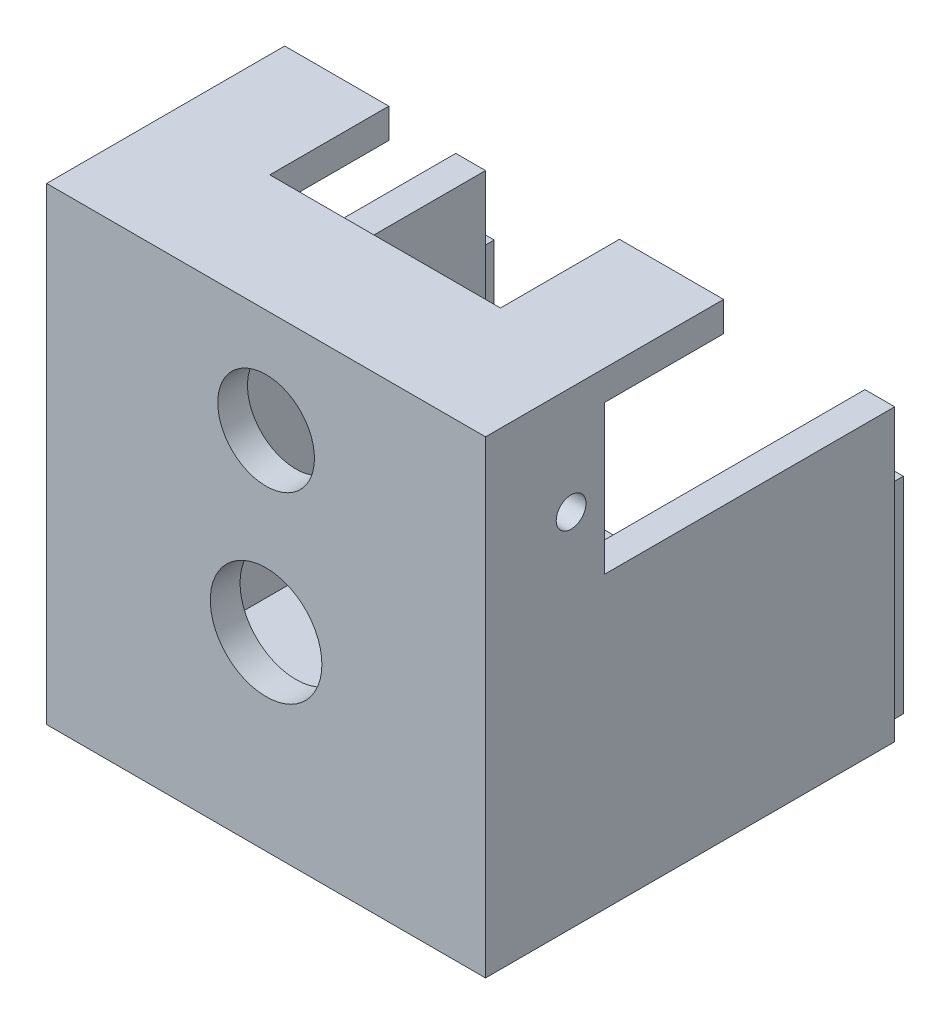
ISO-10303-21;
HEADER;
FILE_DESCRIPTION(('STEP AP214'),'2;1');
FILE_NAME('part.step','',(''),(''),'','','');
FILE_SCHEMA(('AUTOMOTIVE_DESIGN { 1 0 10303 214 1 1 1 1 }'));
ENDSEC;
DATA;
#1=APPLICATION_CONTEXT('core data for automotive mechanical design processes');
#2=APPLICATION_PROTOCOL_DEFINITION('international standard','automotive_design',2000,#1);
#3=PRODUCT_CONTEXT('',#1,'mechanical');
#4=PRODUCT('Part','Part','',(#3));
#5=PRODUCT_RELATED_PRODUCT_CATEGORY('part','',(#4));
#6=PRODUCT_DEFINITION_FORMATION('','',#4);
#7=PRODUCT_DEFINITION_CONTEXT('part definition',#1,'design');
#8=PRODUCT_DEFINITION('design','',#6,#7);
#9=PRODUCT_DEFINITION_SHAPE('','',#8);
#10=(LENGTH_UNIT() NAMED_UNIT(*) SI_UNIT(.MILLI.,.METRE.));
#11=(NAMED_UNIT(*) PLANE_ANGLE_UNIT() SI_UNIT($,.RADIAN.));
#12=(NAMED_UNIT(*) SI_UNIT($,.STERADIAN.) SOLID_ANGLE_UNIT());
#13=UNCERTAINTY_MEASURE_WITH_UNIT(LENGTH_MEASURE(1.E-05),#10,'distance_accuracy_value','');
#14=(GEOMETRIC_REPRESENTATION_CONTEXT(3) GLOBAL_UNCERTAINTY_ASSIGNED_CONTEXT((#13)) GLOBAL_UNIT_ASSIGNED_CONTEXT((#10,
#11,#12)) REPRESENTATION_CONTEXT('',''));
#15=CARTESIAN_POINT('',(0.,0.,0.));
#16=DIRECTION('',(0.,0.,1.));
#17=DIRECTION('',(1.,0.,0.));
#18=AXIS2_PLACEMENT_3D('',#15,#16,#17);
#19=CARTESIAN_POINT('',(0.,0.,0.));
#20=DIRECTION('',(0.,0.,-1.));
#21=DIRECTION('',(-1.,0.,0.));
#22=AXIS2_PLACEMENT_3D('',#19,#20,#21);
#23=PLANE('',#22);
#24=CARTESIAN_POINT('',(0.,-23.5,0.));
#25=DIRECTION('',(0.,0.,-1.));
#26=DIRECTION('',(-1.,0.,0.));
#27=AXIS2_PLACEMENT_3D('',#24,#25,#26);
#28=CIRCLE('',#27,7.5);
#29=CARTESIAN_POINT('',(-7.5,-23.5,0.));
#30=VERTEX_POINT('',#29);
#31=EDGE_CURVE('E268',#30,#30,#28,.T.);
#32=ORIENTED_EDGE('',*,*,#31,.F.);
#33=EDGE_LOOP('',(#32));
#34=FACE_BOUND('',#33,.T.);
#35=CARTESIAN_POINT('',(0.,0.,0.));
#36=DIRECTION('',(0.,0.,1.));
#37=DIRECTION('',(1.,0.,0.));
#38=AXIS2_PLACEMENT_3D('',#35,#36,#37);
#39=CIRCLE('',#38,6.5);
#40=CARTESIAN_POINT('',(6.5,0.,0.));
#41=VERTEX_POINT('',#40);
#42=EDGE_CURVE('E503',#41,#41,#39,.T.);
#43=ORIENTED_EDGE('',*,*,#42,.T.);
#44=EDGE_LOOP('',(#43));
#45=FACE_BOUND('',#44,.T.);
#46=DIRECTION('',(-1.,0.,0.));
#47=VECTOR('',#46,1.);
#48=CARTESIAN_POINT('',(-29.5,10.,0.));
#49=LINE('',#48,#47);
#50=CARTESIAN_POINT('',(25.5,10.,0.));
#51=VERTEX_POINT('',#50);
#52=CARTESIAN_POINT('',(-25.5,10.,0.));
#53=VERTEX_POINT('',#52);
#54=EDGE_CURVE('E515',#51,#53,#49,.T.);
#55=ORIENTED_EDGE('',*,*,#54,.F.);
#56=DIRECTION('',(0.,1.,0.));
#57=VECTOR('',#56,1.);
#58=CARTESIAN_POINT('',(25.5,-10.,0.));
#59=LINE('',#58,#57);
#60=CARTESIAN_POINT('',(25.5,-45.,0.));
#61=VERTEX_POINT('',#60);
#62=EDGE_CURVE('E397',#61,#51,#59,.T.);
#63=ORIENTED_EDGE('',*,*,#62,.F.);
#64=DIRECTION('',(1.,0.,0.));
#65=VECTOR('',#64,1.);
#66=CARTESIAN_POINT('',(-25.5,-45.,0.));
#67=LINE('',#66,#65);
#68=CARTESIAN_POINT('',(-25.5,-45.,0.));
#69=VERTEX_POINT('',#68);
#70=EDGE_CURVE('E337',#69,#61,#67,.T.);
#71=ORIENTED_EDGE('',*,*,#70,.F.);
#72=DIRECTION('',(0.,-1.,0.));
#73=VECTOR('',#72,1.);
#74=CARTESIAN_POINT('',(-25.5,-10.,0.));
#75=LINE('',#74,#73);
#76=EDGE_CURVE('E400',#53,#69,#75,.T.);
#77=ORIENTED_EDGE('',*,*,#76,.F.);
#78=EDGE_LOOP('',(#55,#63,#71,#77));
#79=FACE_BOUND('',#78,.T.);
#80=ADVANCED_FACE('F44',(#34,#45,#79),#23,.T.);
#81=CARTESIAN_POINT('',(0.,10.,0.));
#82=DIRECTION('',(0.,-1.,0.));
#83=DIRECTION('',(0.,0.,-1.));
#84=AXIS2_PLACEMENT_3D('',#81,#82,#83);
#85=PLANE('',#84);
#86=DIRECTION('',(1.,0.,0.));
#87=VECTOR('',#86,1.);
#88=CARTESIAN_POINT('',(29.5,10.,-12.));
#89=LINE('',#88,#87);
#90=CARTESIAN_POINT('',(25.5,10.,-12.));
#91=VERTEX_POINT('',#90);
#92=CARTESIAN_POINT('',(29.5,10.,-12.));
#93=VERTEX_POINT('',#92);
#94=EDGE_CURVE('E396',#91,#93,#89,.T.);
#95=ORIENTED_EDGE('',*,*,#94,.F.);
#96=DIRECTION('',(0.,0.,1.));
#97=VECTOR('',#96,1.);
#98=CARTESIAN_POINT('',(25.5,10.,-12.));
#99=LINE('',#98,#97);
#100=EDGE_CURVE('E392',#91,#51,#99,.T.);
#101=ORIENTED_EDGE('',*,*,#100,.T.);
#102=ORIENTED_EDGE('',*,*,#54,.T.);
#103=DIRECTION('',(0.,0.,1.));
#104=VECTOR('',#103,1.);
#105=CARTESIAN_POINT('',(-25.5,10.,-12.));
#106=LINE('',#105,#104);
#107=CARTESIAN_POINT('',(-25.5,10.,-12.));
#108=VERTEX_POINT('',#107);
#109=EDGE_CURVE('E428',#108,#53,#106,.T.);
#110=ORIENTED_EDGE('',*,*,#109,.F.);
#111=DIRECTION('',(1.,0.,0.));
#112=VECTOR('',#111,1.);
#113=CARTESIAN_POINT('',(-29.5,10.,-12.));
#114=LINE('',#113,#112);
#115=CARTESIAN_POINT('',(-29.5,10.,-12.));
#116=VERTEX_POINT('',#115);
#117=EDGE_CURVE('E70',#116,#108,#114,.T.);
#118=ORIENTED_EDGE('',*,*,#117,.F.);
#119=DIRECTION('',(0.,0.,1.));
#120=VECTOR('',#119,1.);
#121=CARTESIAN_POINT('',(-29.5,10.,4.));
#122=LINE('',#121,#120);
#123=CARTESIAN_POINT('',(-29.5,10.,-28.));
#124=VERTEX_POINT('',#123);
#125=EDGE_CURVE('E486',#124,#116,#122,.T.);
#126=ORIENTED_EDGE('',*,*,#125,.F.);
#127=DIRECTION('',(-1.,0.,0.));
#128=VECTOR('',#127,1.);
#129=CARTESIAN_POINT('',(-29.5,10.,-28.));
#130=LINE('',#129,#128);
#131=CARTESIAN_POINT('',(-15.5,10.,-28.));
#132=VERTEX_POINT('',#131);
#133=EDGE_CURVE('E442',#132,#124,#130,.T.);
#134=ORIENTED_EDGE('',*,*,#133,.F.);
#135=DIRECTION('',(0.,0.,1.));
#136=VECTOR('',#135,1.);
#137=CARTESIAN_POINT('',(-15.5,10.,-28.));
#138=LINE('',#137,#136);
#139=CARTESIAN_POINT('',(-15.5,10.,-12.));
#140=VERTEX_POINT('',#139);
#141=EDGE_CURVE('E438',#132,#140,#138,.T.);
#142=ORIENTED_EDGE('',*,*,#141,.T.);
#143=DIRECTION('',(-1.,0.,0.));
#144=VECTOR('',#143,1.);
#145=CARTESIAN_POINT('',(-29.5,10.,-12.));
#146=LINE('',#145,#144);
#147=CARTESIAN_POINT('',(15.5,10.,-12.));
#148=VERTEX_POINT('',#147);
#149=EDGE_CURVE('E492',#148,#140,#146,.T.);
#150=ORIENTED_EDGE('',*,*,#149,.F.);
#151=DIRECTION('',(0.,0.,1.));
#152=VECTOR('',#151,1.);
#153=CARTESIAN_POINT('',(15.5,10.,-28.));
#154=LINE('',#153,#152);
#155=CARTESIAN_POINT('',(15.5,10.,-28.));
#156=VERTEX_POINT('',#155);
#157=EDGE_CURVE('E482',#156,#148,#154,.T.);
#158=ORIENTED_EDGE('',*,*,#157,.F.);
#159=DIRECTION('',(-1.,0.,0.));
#160=VECTOR('',#159,1.);
#161=CARTESIAN_POINT('',(29.5,10.,-28.));
#162=LINE('',#161,#160);
#163=CARTESIAN_POINT('',(29.5,10.,-28.));
#164=VERTEX_POINT('',#163);
#165=EDGE_CURVE('E465',#164,#156,#162,.T.);
#166=ORIENTED_EDGE('',*,*,#165,.F.);
#167=DIRECTION('',(0.,0.,-1.));
#168=VECTOR('',#167,1.);
#169=CARTESIAN_POINT('',(29.5,10.,4.));
#170=LINE('',#169,#168);
#171=EDGE_CURVE('E506',#93,#164,#170,.T.);
#172=ORIENTED_EDGE('',*,*,#171,.F.);
#173=EDGE_LOOP('',(#95,#101,#102,#110,#118,#126,#134,#142,#150,#158,#166,#172));
#174=FACE_BOUND('',#173,.T.);
#175=ADVANCED_FACE('F524',(#174),#85,.T.);
#176=CARTESIAN_POINT('',(-29.5,14.,-12.));
#177=DIRECTION('',(0.,0.,1.));
#178=DIRECTION('',(1.,0.,0.));
#179=AXIS2_PLACEMENT_3D('',#176,#177,#178);
#180=PLANE('',#179);
#181=DIRECTION('',(0.,-1.,0.));
#182=VECTOR('',#181,1.);
#183=CARTESIAN_POINT('',(-15.5,14.,-12.));
#184=LINE('',#183,#182);
#185=CARTESIAN_POINT('',(-15.5,14.,-12.));
#186=VERTEX_POINT('',#185);
#187=EDGE_CURVE('E443',#186,#140,#184,.T.);
#188=ORIENTED_EDGE('',*,*,#187,.F.);
#189=DIRECTION('',(-1.,0.,0.));
#190=VECTOR('',#189,1.);
#191=CARTESIAN_POINT('',(-29.5,14.,-12.));
#192=LINE('',#191,#190);
#193=CARTESIAN_POINT('',(15.5,14.,-12.));
#194=VERTEX_POINT('',#193);
#195=EDGE_CURVE('E499',#194,#186,#192,.T.);
#196=ORIENTED_EDGE('',*,*,#195,.F.);
#197=DIRECTION('',(0.,1.,0.));
#198=VECTOR('',#197,1.);
#199=CARTESIAN_POINT('',(15.5,10.,-12.));
#200=LINE('',#199,#198);
#201=EDGE_CURVE('E447',#148,#194,#200,.T.);
#202=ORIENTED_EDGE('',*,*,#201,.F.);
#203=ORIENTED_EDGE('',*,*,#149,.T.);
#204=EDGE_LOOP('',(#188,#196,#202,#203));
#205=FACE_BOUND('',#204,.T.);
#206=ADVANCED_FACE('F591',(#205),#180,.F.);
#207=CARTESIAN_POINT('',(0.,0.,4.));
#208=DIRECTION('',(0.,0.,-1.));
#209=DIRECTION('',(-1.,0.,0.));
#210=AXIS2_PLACEMENT_3D('',#207,#208,#209);
#211=PLANE('',#210);
#212=CARTESIAN_POINT('',(0.,-23.5,4.));
#213=DIRECTION('',(0.,0.,1.));
#214=DIRECTION('',(1.,0.,0.));
#215=AXIS2_PLACEMENT_3D('',#212,#213,#214);
#216=CIRCLE('',#215,7.5);
#217=CARTESIAN_POINT('',(7.5,-23.5,4.));
#218=VERTEX_POINT('',#217);
#219=EDGE_CURVE('E1040',#218,#218,#216,.T.);
#220=ORIENTED_EDGE('',*,*,#219,.F.);
#221=EDGE_LOOP('',(#220));
#222=FACE_BOUND('',#221,.T.);
#223=DIRECTION('',(0.,1.,0.));
#224=VECTOR('',#223,1.);
#225=CARTESIAN_POINT('',(29.5,-10.,4.));
#226=LINE('',#225,#224);
#227=CARTESIAN_POINT('',(29.5,-49.,4.));
#228=VERTEX_POINT('',#227);
#229=CARTESIAN_POINT('',(29.5,14.,4.));
#230=VERTEX_POINT('',#229);
#231=EDGE_CURVE('E54',#228,#230,#226,.T.);
#232=ORIENTED_EDGE('',*,*,#231,.T.);
#233=DIRECTION('',(1.,0.,0.));
#234=VECTOR('',#233,1.);
#235=CARTESIAN_POINT('',(-29.5,14.,4.));
#236=LINE('',#235,#234);
#237=CARTESIAN_POINT('',(-29.5,14.,4.));
#238=VERTEX_POINT('',#237);
#239=EDGE_CURVE('E491',#238,#230,#236,.T.);
#240=ORIENTED_EDGE('',*,*,#239,.F.);
#241=DIRECTION('',(0.,-1.,0.));
#242=VECTOR('',#241,1.);
#243=CARTESIAN_POINT('',(-29.5,-10.,4.));
#244=LINE('',#243,#242);
#245=CARTESIAN_POINT('',(-29.5,-49.,4.));
#246=VERTEX_POINT('',#245);
#247=EDGE_CURVE('E11',#238,#246,#244,.T.);
#248=ORIENTED_EDGE('',*,*,#247,.T.);
#249=DIRECTION('',(-1.,0.,0.));
#250=VECTOR('',#249,1.);
#251=CARTESIAN_POINT('',(-29.5,-49.,4.));
#252=LINE('',#251,#250);
#253=EDGE_CURVE('E325',#228,#246,#252,.T.);
#254=ORIENTED_EDGE('',*,*,#253,.F.);
#255=EDGE_LOOP('',(#232,#240,#248,#254));
#256=FACE_BOUND('',#255,.T.);
#257=CARTESIAN_POINT('',(0.,0.,4.));
#258=DIRECTION('',(0.,0.,1.));
#259=DIRECTION('',(1.,0.,0.));
#260=AXIS2_PLACEMENT_3D('',#257,#258,#259);
#261=CIRCLE('',#260,6.5);
#262=CARTESIAN_POINT('',(6.5,0.,4.));
#263=VERTEX_POINT('',#262);
#264=EDGE_CURVE('E511',#263,#263,#261,.T.);
#265=ORIENTED_EDGE('',*,*,#264,.F.);
#266=EDGE_LOOP('',(#265));
#267=FACE_BOUND('',#266,.T.);
#268=ADVANCED_FACE('F587',(#222,#256,#267),#211,.F.);
#269=CARTESIAN_POINT('',(29.5,-10.,4.));
#270=DIRECTION('',(-1.,0.,0.));
#271=DIRECTION('',(0.,0.,1.));
#272=AXIS2_PLACEMENT_3D('',#269,#270,#271);
#273=PLANE('',#272);
#274=CARTESIAN_POINT('',(29.5,-0.500000000000002,-7.5));
#275=DIRECTION('',(-1.,0.,0.));
#276=DIRECTION('',(0.,0.,1.));
#277=AXIS2_PLACEMENT_3D('',#274,#275,#276);
#278=CIRCLE('',#277,2.);
#279=CARTESIAN_POINT('',(29.5,-0.500000000000002,-5.5));
#280=VERTEX_POINT('',#279);
#281=EDGE_CURVE('E388',#280,#280,#278,.T.);
#282=ORIENTED_EDGE('',*,*,#281,.T.);
#283=EDGE_LOOP('',(#282));
#284=FACE_BOUND('',#283,.T.);
#285=DIRECTION('',(0.,-1.,0.));
#286=VECTOR('',#285,1.);
#287=CARTESIAN_POINT('',(29.5,-10.,-12.));
#288=LINE('',#287,#286);
#289=CARTESIAN_POINT('',(29.5,-10.,-12.));
#290=VERTEX_POINT('',#289);
#291=EDGE_CURVE('E401',#93,#290,#288,.T.);
#292=ORIENTED_EDGE('',*,*,#291,.F.);
#293=ORIENTED_EDGE('',*,*,#171,.T.);
#294=DIRECTION('',(0.,-1.,0.));
#295=VECTOR('',#294,1.);
#296=CARTESIAN_POINT('',(29.5,10.,-28.));
#297=LINE('',#296,#295);
#298=CARTESIAN_POINT('',(29.5,14.,-28.));
#299=VERTEX_POINT('',#298);
#300=EDGE_CURVE('E461',#299,#164,#297,.T.);
#301=ORIENTED_EDGE('',*,*,#300,.F.);
#302=DIRECTION('',(0.,0.,-1.));
#303=VECTOR('',#302,1.);
#304=CARTESIAN_POINT('',(29.5,14.,4.));
#305=LINE('',#304,#303);
#306=EDGE_CURVE('E496',#230,#299,#305,.T.);
#307=ORIENTED_EDGE('',*,*,#306,.F.);
#308=ORIENTED_EDGE('',*,*,#231,.F.);
#309=DIRECTION('',(0.,0.,1.));
#310=VECTOR('',#309,1.);
#311=CARTESIAN_POINT('',(29.5,-49.,4.));
#312=LINE('',#311,#310);
#313=CARTESIAN_POINT('',(29.5,-49.,-51.));
#314=VERTEX_POINT('',#313);
#315=EDGE_CURVE('E321',#314,#228,#312,.T.);
#316=ORIENTED_EDGE('',*,*,#315,.F.);
#317=DIRECTION('',(0.,1.,0.));
#318=VECTOR('',#317,1.);
#319=CARTESIAN_POINT('',(29.5,-45.,-51.));
#320=LINE('',#319,#318);
#321=CARTESIAN_POINT('',(29.5,-10.,-51.));
#322=VERTEX_POINT('',#321);
#323=EDGE_CURVE('E346',#314,#322,#320,.T.);
#324=ORIENTED_EDGE('',*,*,#323,.T.);
#325=DIRECTION('',(0.,0.,1.));
#326=VECTOR('',#325,1.);
#327=CARTESIAN_POINT('',(29.5,-10.,4.));
#328=LINE('',#327,#326);
#329=EDGE_CURVE('E338',#322,#290,#328,.T.);
#330=ORIENTED_EDGE('',*,*,#329,.T.);
#331=EDGE_LOOP('',(#292,#293,#301,#307,#308,#316,#324,#330));
#332=FACE_BOUND('',#331,.T.);
#333=ADVANCED_FACE('F46',(#284,#332),#273,.F.);
#334=CARTESIAN_POINT('',(-29.5,-10.,4.));
#335=DIRECTION('',(1.,0.,0.));
#336=DIRECTION('',(0.,0.,-1.));
#337=AXIS2_PLACEMENT_3D('',#334,#335,#336);
#338=PLANE('',#337);
#339=CARTESIAN_POINT('',(-29.5,-0.500000000000002,-7.5));
#340=DIRECTION('',(-1.,0.,0.));
#341=DIRECTION('',(0.,0.,1.));
#342=AXIS2_PLACEMENT_3D('',#339,#340,#341);
#343=CIRCLE('',#342,2.);
#344=CARTESIAN_POINT('',(-29.5,-0.500000000000002,-5.5));
#345=VERTEX_POINT('',#344);
#346=EDGE_CURVE('E380',#345,#345,#343,.T.);
#347=ORIENTED_EDGE('',*,*,#346,.F.);
#348=EDGE_LOOP('',(#347));
#349=FACE_BOUND('',#348,.T.);
#350=DIRECTION('',(0.,1.,0.));
#351=VECTOR('',#350,1.);
#352=CARTESIAN_POINT('',(-29.5,-10.,-12.));
#353=LINE('',#352,#351);
#354=CARTESIAN_POINT('',(-29.5,-10.,-12.));
#355=VERTEX_POINT('',#354);
#356=EDGE_CURVE('E414',#355,#116,#353,.T.);
#357=ORIENTED_EDGE('',*,*,#356,.F.);
#358=DIRECTION('',(0.,0.,-1.));
#359=VECTOR('',#358,1.);
#360=CARTESIAN_POINT('',(-29.5,-10.,4.));
#361=LINE('',#360,#359);
#362=CARTESIAN_POINT('',(-29.5,-10.,-51.));
#363=VERTEX_POINT('',#362);
#364=EDGE_CURVE('E329',#355,#363,#361,.T.);
#365=ORIENTED_EDGE('',*,*,#364,.T.);
#366=DIRECTION('',(0.,1.,0.));
#367=VECTOR('',#366,1.);
#368=CARTESIAN_POINT('',(-29.5,-45.,-51.));
#369=LINE('',#368,#367);
#370=CARTESIAN_POINT('',(-29.5,-49.,-51.));
#371=VERTEX_POINT('',#370);
#372=EDGE_CURVE('E376',#371,#363,#369,.T.);
#373=ORIENTED_EDGE('',*,*,#372,.F.);
#374=DIRECTION('',(0.,0.,-1.));
#375=VECTOR('',#374,1.);
#376=CARTESIAN_POINT('',(-29.5,-49.,4.));
#377=LINE('',#376,#375);
#378=EDGE_CURVE('E313',#246,#371,#377,.T.);
#379=ORIENTED_EDGE('',*,*,#378,.F.);
#380=ORIENTED_EDGE('',*,*,#247,.F.);
#381=DIRECTION('',(0.,0.,1.));
#382=VECTOR('',#381,1.);
#383=CARTESIAN_POINT('',(-29.5,14.,4.));
#384=LINE('',#383,#382);
#385=CARTESIAN_POINT('',(-29.5,14.,-28.));
#386=VERTEX_POINT('',#385);
#387=EDGE_CURVE('E487',#386,#238,#384,.T.);
#388=ORIENTED_EDGE('',*,*,#387,.F.);
#389=DIRECTION('',(0.,1.,0.));
#390=VECTOR('',#389,1.);
#391=CARTESIAN_POINT('',(-29.5,14.,-28.));
#392=LINE('',#391,#390);
#393=EDGE_CURVE('E448',#124,#386,#392,.T.);
#394=ORIENTED_EDGE('',*,*,#393,.F.);
#395=ORIENTED_EDGE('',*,*,#125,.T.);
#396=EDGE_LOOP('',(#357,#365,#373,#379,#380,#388,#394,#395));
#397=FACE_BOUND('',#396,.T.);
#398=ADVANCED_FACE('F537',(#349,#397),#338,.F.);
#399=CARTESIAN_POINT('',(0.,0.,4.));
#400=DIRECTION('',(0.,0.,-1.));
#401=DIRECTION('',(-1.,0.,0.));
#402=AXIS2_PLACEMENT_3D('',#399,#400,#401);
#403=CYLINDRICAL_SURFACE('',#402,6.5);
#404=ORIENTED_EDGE('',*,*,#264,.T.);
#405=EDGE_LOOP('',(#404));
#406=FACE_BOUND('',#405,.T.);
#407=ORIENTED_EDGE('',*,*,#42,.F.);
#408=EDGE_LOOP('',(#407));
#409=FACE_BOUND('',#408,.T.);
#410=ADVANCED_FACE('F612',(#406,#409),#403,.F.);
#411=CARTESIAN_POINT('',(0.,14.,0.));
#412=DIRECTION('',(0.,-1.,0.));
#413=DIRECTION('',(0.,0.,-1.));
#414=AXIS2_PLACEMENT_3D('',#411,#412,#413);
#415=PLANE('',#414);
#416=ORIENTED_EDGE('',*,*,#387,.T.);
#417=ORIENTED_EDGE('',*,*,#239,.T.);
#418=ORIENTED_EDGE('',*,*,#306,.T.);
#419=DIRECTION('',(1.,0.,0.));
#420=VECTOR('',#419,1.);
#421=CARTESIAN_POINT('',(29.5,14.,-28.));
#422=LINE('',#421,#420);
#423=CARTESIAN_POINT('',(15.5,14.,-28.));
#424=VERTEX_POINT('',#423);
#425=EDGE_CURVE('E471',#424,#299,#422,.T.);
#426=ORIENTED_EDGE('',*,*,#425,.F.);
#427=DIRECTION('',(0.,0.,1.));
#428=VECTOR('',#427,1.);
#429=CARTESIAN_POINT('',(15.5,14.,-28.));
#430=LINE('',#429,#428);
#431=EDGE_CURVE('E475',#424,#194,#430,.T.);
#432=ORIENTED_EDGE('',*,*,#431,.T.);
#433=ORIENTED_EDGE('',*,*,#195,.T.);
#434=DIRECTION('',(0.,0.,1.));
#435=VECTOR('',#434,1.);
#436=CARTESIAN_POINT('',(-15.5,14.,-28.));
#437=LINE('',#436,#435);
#438=CARTESIAN_POINT('',(-15.5,14.,-28.));
#439=VERTEX_POINT('',#438);
#440=EDGE_CURVE('E434',#439,#186,#437,.T.);
#441=ORIENTED_EDGE('',*,*,#440,.F.);
#442=DIRECTION('',(1.,0.,0.));
#443=VECTOR('',#442,1.);
#444=CARTESIAN_POINT('',(-29.5,14.,-28.));
#445=LINE('',#444,#443);
#446=EDGE_CURVE('E455',#386,#439,#445,.T.);
#447=ORIENTED_EDGE('',*,*,#446,.F.);
#448=EDGE_LOOP('',(#416,#417,#418,#426,#432,#433,#441,#447));
#449=FACE_BOUND('',#448,.T.);
#450=ADVANCED_FACE('F590',(#449),#415,.F.);
#451=CARTESIAN_POINT('',(15.5,10.,-28.));
#452=DIRECTION('',(1.,0.,0.));
#453=DIRECTION('',(0.,0.,-1.));
#454=AXIS2_PLACEMENT_3D('',#451,#452,#453);
#455=PLANE('',#454);
#456=ORIENTED_EDGE('',*,*,#201,.T.);
#457=ORIENTED_EDGE('',*,*,#431,.F.);
#458=DIRECTION('',(0.,1.,0.));
#459=VECTOR('',#458,1.);
#460=CARTESIAN_POINT('',(15.5,10.,-28.));
#461=LINE('',#460,#459);
#462=EDGE_CURVE('E468',#156,#424,#461,.T.);
#463=ORIENTED_EDGE('',*,*,#462,.F.);
#464=ORIENTED_EDGE('',*,*,#157,.T.);
#465=EDGE_LOOP('',(#456,#457,#463,#464));
#466=FACE_BOUND('',#465,.T.);
#467=ADVANCED_FACE('F555',(#466),#455,.F.);
#468=CARTESIAN_POINT('',(0.,0.,-28.));
#469=DIRECTION('',(0.,0.,1.));
#470=DIRECTION('',(1.,0.,0.));
#471=AXIS2_PLACEMENT_3D('',#468,#469,#470);
#472=PLANE('',#471);
#473=ORIENTED_EDGE('',*,*,#300,.T.);
#474=ORIENTED_EDGE('',*,*,#165,.T.);
#475=ORIENTED_EDGE('',*,*,#462,.T.);
#476=ORIENTED_EDGE('',*,*,#425,.T.);
#477=EDGE_LOOP('',(#473,#474,#475,#476));
#478=FACE_BOUND('',#477,.T.);
#479=ADVANCED_FACE('F559',(#478),#472,.F.);
#480=CARTESIAN_POINT('',(-15.5,14.,-28.));
#481=DIRECTION('',(-1.,0.,0.));
#482=DIRECTION('',(0.,0.,1.));
#483=AXIS2_PLACEMENT_3D('',#480,#481,#482);
#484=PLANE('',#483);
#485=ORIENTED_EDGE('',*,*,#187,.T.);
#486=ORIENTED_EDGE('',*,*,#141,.F.);
#487=DIRECTION('',(0.,-1.,0.));
#488=VECTOR('',#487,1.);
#489=CARTESIAN_POINT('',(-15.5,14.,-28.));
#490=LINE('',#489,#488);
#491=EDGE_CURVE('E452',#439,#132,#490,.T.);
#492=ORIENTED_EDGE('',*,*,#491,.F.);
#493=ORIENTED_EDGE('',*,*,#440,.T.);
#494=EDGE_LOOP('',(#485,#486,#492,#493));
#495=FACE_BOUND('',#494,.T.);
#496=ADVANCED_FACE('F548',(#495),#484,.F.);
#497=CARTESIAN_POINT('',(0.,0.,-28.));
#498=DIRECTION('',(0.,0.,1.));
#499=DIRECTION('',(1.,0.,0.));
#500=AXIS2_PLACEMENT_3D('',#497,#498,#499);
#501=PLANE('',#500);
#502=ORIENTED_EDGE('',*,*,#393,.T.);
#503=ORIENTED_EDGE('',*,*,#446,.T.);
#504=ORIENTED_EDGE('',*,*,#491,.T.);
#505=ORIENTED_EDGE('',*,*,#133,.T.);
#506=EDGE_LOOP('',(#502,#503,#504,#505));
#507=FACE_BOUND('',#506,.T.);
#508=ADVANCED_FACE('F542',(#507),#501,.F.);
#509=CARTESIAN_POINT('',(-25.5,-10.,-12.));
#510=DIRECTION('',(-1.,0.,0.));
#511=DIRECTION('',(0.,0.,1.));
#512=AXIS2_PLACEMENT_3D('',#509,#510,#511);
#513=PLANE('',#512);
#514=CARTESIAN_POINT('',(-25.5,-0.500000000000002,-7.5));
#515=DIRECTION('',(-1.,0.,0.));
#516=DIRECTION('',(0.,0.,1.));
#517=AXIS2_PLACEMENT_3D('',#514,#515,#516);
#518=CIRCLE('',#517,2.);
#519=CARTESIAN_POINT('',(-25.5,-0.500000000000002,-5.5));
#520=VERTEX_POINT('',#519);
#521=EDGE_CURVE('E384',#520,#520,#518,.T.);
#522=ORIENTED_EDGE('',*,*,#521,.T.);
#523=EDGE_LOOP('',(#522));
#524=FACE_BOUND('',#523,.T.);
#525=ORIENTED_EDGE('',*,*,#76,.T.);
#526=DIRECTION('',(0.,0.,1.));
#527=VECTOR('',#526,1.);
#528=CARTESIAN_POINT('',(-25.5,-45.,0.));
#529=LINE('',#528,#527);
#530=CARTESIAN_POINT('',(-25.5,-45.,-51.));
#531=VERTEX_POINT('',#530);
#532=EDGE_CURVE('E333',#531,#69,#529,.T.);
#533=ORIENTED_EDGE('',*,*,#532,.F.);
#534=DIRECTION('',(0.,1.,0.));
#535=VECTOR('',#534,1.);
#536=CARTESIAN_POINT('',(-25.5,-45.,-51.));
#537=LINE('',#536,#535);
#538=CARTESIAN_POINT('',(-25.5,-10.,-51.));
#539=VERTEX_POINT('',#538);
#540=EDGE_CURVE('E372',#531,#539,#537,.T.);
#541=ORIENTED_EDGE('',*,*,#540,.T.);
#542=DIRECTION('',(0.,0.,1.));
#543=VECTOR('',#542,1.);
#544=CARTESIAN_POINT('',(-25.5,-10.,0.));
#545=LINE('',#544,#543);
#546=CARTESIAN_POINT('',(-25.5,-10.,-12.));
#547=VERTEX_POINT('',#546);
#548=EDGE_CURVE('E352',#539,#547,#545,.T.);
#549=ORIENTED_EDGE('',*,*,#548,.T.);
#550=DIRECTION('',(0.,-1.,0.));
#551=VECTOR('',#550,1.);
#552=CARTESIAN_POINT('',(-25.5,-10.,-12.));
#553=LINE('',#552,#551);
#554=EDGE_CURVE('E420',#108,#547,#553,.T.);
#555=ORIENTED_EDGE('',*,*,#554,.F.);
#556=ORIENTED_EDGE('',*,*,#109,.T.);
#557=EDGE_LOOP('',(#525,#533,#541,#549,#555,#556));
#558=FACE_BOUND('',#557,.T.);
#559=ADVANCED_FACE('F531',(#524,#558),#513,.F.);
#560=CARTESIAN_POINT('',(0.,0.,-12.));
#561=DIRECTION('',(0.,0.,-1.));
#562=DIRECTION('',(-1.,0.,0.));
#563=AXIS2_PLACEMENT_3D('',#560,#561,#562);
#564=PLANE('',#563);
#565=ORIENTED_EDGE('',*,*,#356,.T.);
#566=ORIENTED_EDGE('',*,*,#117,.T.);
#567=ORIENTED_EDGE('',*,*,#554,.T.);
#568=DIRECTION('',(-1.,0.,0.));
#569=VECTOR('',#568,1.);
#570=CARTESIAN_POINT('',(-29.5,-10.,-12.));
#571=LINE('',#570,#569);
#572=EDGE_CURVE('E424',#547,#355,#571,.T.);
#573=ORIENTED_EDGE('',*,*,#572,.T.);
#574=EDGE_LOOP('',(#565,#566,#567,#573));
#575=FACE_BOUND('',#574,.T.);
#576=ADVANCED_FACE('F534',(#575),#564,.T.);
#577=CARTESIAN_POINT('',(25.5,-10.,-12.));
#578=DIRECTION('',(1.,0.,0.));
#579=DIRECTION('',(0.,0.,-1.));
#580=AXIS2_PLACEMENT_3D('',#577,#578,#579);
#581=PLANE('',#580);
#582=CARTESIAN_POINT('',(25.5,-0.500000000000002,-7.5));
#583=DIRECTION('',(1.,0.,0.));
#584=DIRECTION('',(0.,0.,-1.));
#585=AXIS2_PLACEMENT_3D('',#582,#583,#584);
#586=CIRCLE('',#585,2.);
#587=CARTESIAN_POINT('',(25.5,-0.500000000000002,-9.5));
#588=VERTEX_POINT('',#587);
#589=EDGE_CURVE('E48',#588,#588,#586,.T.);
#590=ORIENTED_EDGE('',*,*,#589,.T.);
#591=EDGE_LOOP('',(#590));
#592=FACE_BOUND('',#591,.T.);
#593=ORIENTED_EDGE('',*,*,#62,.T.);
#594=ORIENTED_EDGE('',*,*,#100,.F.);
#595=DIRECTION('',(0.,1.,0.));
#596=VECTOR('',#595,1.);
#597=CARTESIAN_POINT('',(25.5,-10.,-12.));
#598=LINE('',#597,#596);
#599=CARTESIAN_POINT('',(25.5,-10.,-12.));
#600=VERTEX_POINT('',#599);
#601=EDGE_CURVE('E404',#600,#91,#598,.T.);
#602=ORIENTED_EDGE('',*,*,#601,.F.);
#603=DIRECTION('',(0.,0.,-1.));
#604=VECTOR('',#603,1.);
#605=CARTESIAN_POINT('',(25.5,-10.,0.));
#606=LINE('',#605,#604);
#607=CARTESIAN_POINT('',(25.5,-10.,-51.));
#608=VERTEX_POINT('',#607);
#609=EDGE_CURVE('E356',#600,#608,#606,.T.);
#610=ORIENTED_EDGE('',*,*,#609,.T.);
#611=DIRECTION('',(0.,1.,0.));
#612=VECTOR('',#611,1.);
#613=CARTESIAN_POINT('',(25.5,-45.,-51.));
#614=LINE('',#613,#612);
#615=CARTESIAN_POINT('',(25.5,-45.,-51.));
#616=VERTEX_POINT('',#615);
#617=EDGE_CURVE('E368',#616,#608,#614,.T.);
#618=ORIENTED_EDGE('',*,*,#617,.F.);
#619=DIRECTION('',(0.,0.,-1.));
#620=VECTOR('',#619,1.);
#621=CARTESIAN_POINT('',(25.5,-45.,0.));
#622=LINE('',#621,#620);
#623=EDGE_CURVE('E342',#61,#616,#622,.T.);
#624=ORIENTED_EDGE('',*,*,#623,.F.);
#625=EDGE_LOOP('',(#593,#594,#602,#610,#618,#624));
#626=FACE_BOUND('',#625,.T.);
#627=ADVANCED_FACE('F570',(#592,#626),#581,.F.);
#628=CARTESIAN_POINT('',(0.,0.,-12.));
#629=DIRECTION('',(0.,0.,1.));
#630=DIRECTION('',(1.,0.,0.));
#631=AXIS2_PLACEMENT_3D('',#628,#629,#630);
#632=PLANE('',#631);
#633=ORIENTED_EDGE('',*,*,#291,.T.);
#634=DIRECTION('',(-1.,0.,0.));
#635=VECTOR('',#634,1.);
#636=CARTESIAN_POINT('',(29.5,-10.,-12.));
#637=LINE('',#636,#635);
#638=EDGE_CURVE('E407',#290,#600,#637,.T.);
#639=ORIENTED_EDGE('',*,*,#638,.T.);
#640=ORIENTED_EDGE('',*,*,#601,.T.);
#641=ORIENTED_EDGE('',*,*,#94,.T.);
#642=EDGE_LOOP('',(#633,#639,#640,#641));
#643=FACE_BOUND('',#642,.T.);
#644=ADVANCED_FACE('F567',(#643),#632,.F.);
#645=CARTESIAN_POINT('',(50.5,-0.500000000000002,-7.5));
#646=DIRECTION('',(-1.,0.,0.));
#647=DIRECTION('',(0.,0.,1.));
#648=AXIS2_PLACEMENT_3D('',#645,#646,#647);
#649=CYLINDRICAL_SURFACE('',#648,2.);
#650=ORIENTED_EDGE('',*,*,#589,.F.);
#651=EDGE_LOOP('',(#650));
#652=FACE_BOUND('',#651,.T.);
#653=ORIENTED_EDGE('',*,*,#281,.F.);
#654=EDGE_LOOP('',(#653));
#655=FACE_BOUND('',#654,.T.);
#656=ADVANCED_FACE('F625',(#652,#655),#649,.F.);
#657=ORIENTED_EDGE('',*,*,#346,.T.);
#658=EDGE_LOOP('',(#657));
#659=FACE_BOUND('',#658,.T.);
#660=ORIENTED_EDGE('',*,*,#521,.F.);
#661=EDGE_LOOP('',(#660));
#662=FACE_BOUND('',#661,.T.);
#663=ADVANCED_FACE('F622',(#659,#662),#649,.F.);
#664=CARTESIAN_POINT('',(0.,-10.,0.));
#665=DIRECTION('',(0.,-1.,0.));
#666=DIRECTION('',(0.,0.,-1.));
#667=AXIS2_PLACEMENT_3D('',#664,#665,#666);
#668=PLANE('',#667);
#669=ORIENTED_EDGE('',*,*,#572,.F.);
#670=ORIENTED_EDGE('',*,*,#548,.F.);
#671=DIRECTION('',(1.,0.,0.));
#672=VECTOR('',#671,1.);
#673=CARTESIAN_POINT('',(-29.5,-10.,-51.));
#674=LINE('',#673,#672);
#675=EDGE_CURVE('E349',#363,#539,#674,.T.);
#676=ORIENTED_EDGE('',*,*,#675,.F.);
#677=ORIENTED_EDGE('',*,*,#364,.F.);
#678=EDGE_LOOP('',(#669,#670,#676,#677));
#679=FACE_BOUND('',#678,.T.);
#680=ADVANCED_FACE('F577',(#679),#668,.F.);
#681=CARTESIAN_POINT('',(-29.5,-45.,-51.));
#682=DIRECTION('',(0.,0.,1.));
#683=DIRECTION('',(1.,0.,0.));
#684=AXIS2_PLACEMENT_3D('',#681,#682,#683);
#685=PLANE('',#684);
#686=DIRECTION('',(-1.,0.,0.));
#687=VECTOR('',#686,1.);
#688=CARTESIAN_POINT('',(0.,-20.,-51.));
#689=LINE('',#688,#687);
#690=CARTESIAN_POINT('',(28.1666666666667,-20.,-51.));
#691=VERTEX_POINT('',#690);
#692=CARTESIAN_POINT('',(26.8333333333333,-20.,-51.));
#693=VERTEX_POINT('',#692);
#694=EDGE_CURVE('E267',#691,#693,#689,.T.);
#695=ORIENTED_EDGE('',*,*,#694,.T.);
#696=DIRECTION('',(0.,-1.,0.));
#697=VECTOR('',#696,1.);
#698=CARTESIAN_POINT('',(26.8333333333333,0.,-51.));
#699=LINE('',#698,#697);
#700=CARTESIAN_POINT('',(26.8333333333333,-46.3333333333333,-51.));
#701=VERTEX_POINT('',#700);
#702=EDGE_CURVE('E62',#693,#701,#699,.T.);
#703=ORIENTED_EDGE('',*,*,#702,.T.);
#704=DIRECTION('',(-1.,0.,0.));
#705=VECTOR('',#704,1.);
#706=CARTESIAN_POINT('',(0.,-46.3333333333333,-51.));
#707=LINE('',#706,#705);
#708=CARTESIAN_POINT('',(-26.8333333333333,-46.3333333333333,-51.));
#709=VERTEX_POINT('',#708);
#710=EDGE_CURVE('E238',#701,#709,#707,.T.);
#711=ORIENTED_EDGE('',*,*,#710,.T.);
#712=DIRECTION('',(0.,1.,0.));
#713=VECTOR('',#712,1.);
#714=CARTESIAN_POINT('',(-26.8333333333333,0.,-51.));
#715=LINE('',#714,#713);
#716=CARTESIAN_POINT('',(-26.8333333333333,-20.,-51.));
#717=VERTEX_POINT('',#716);
#718=EDGE_CURVE('E284',#709,#717,#715,.T.);
#719=ORIENTED_EDGE('',*,*,#718,.T.);
#720=DIRECTION('',(1.,0.,0.));
#721=VECTOR('',#720,1.);
#722=CARTESIAN_POINT('',(0.,-20.,-51.));
#723=LINE('',#722,#721);
#724=CARTESIAN_POINT('',(-28.1666666666667,-20.,-51.));
#725=VERTEX_POINT('',#724);
#726=EDGE_CURVE('E280',#725,#717,#723,.T.);
#727=ORIENTED_EDGE('',*,*,#726,.F.);
#728=DIRECTION('',(0.,1.,0.));
#729=VECTOR('',#728,1.);
#730=CARTESIAN_POINT('',(-28.1666666666667,0.,-51.));
#731=LINE('',#730,#729);
#732=CARTESIAN_POINT('',(-28.1666666666667,-47.6666666666667,-51.));
#733=VERTEX_POINT('',#732);
#734=EDGE_CURVE('E277',#733,#725,#731,.T.);
#735=ORIENTED_EDGE('',*,*,#734,.F.);
#736=DIRECTION('',(-1.,0.,0.));
#737=VECTOR('',#736,1.);
#738=CARTESIAN_POINT('',(0.,-47.6666666666667,-51.));
#739=LINE('',#738,#737);
#740=CARTESIAN_POINT('',(28.1666666666667,-47.6666666666667,-51.));
#741=VERTEX_POINT('',#740);
#742=EDGE_CURVE('E274',#741,#733,#739,.T.);
#743=ORIENTED_EDGE('',*,*,#742,.F.);
#744=DIRECTION('',(0.,-1.,0.));
#745=VECTOR('',#744,1.);
#746=CARTESIAN_POINT('',(28.1666666666667,0.,-51.));
#747=LINE('',#746,#745);
#748=EDGE_CURVE('E271',#691,#741,#747,.T.);
#749=ORIENTED_EDGE('',*,*,#748,.F.);
#750=EDGE_LOOP('',(#695,#703,#711,#719,#727,#735,#743,#749));
#751=FACE_BOUND('',#750,.T.);
#752=ORIENTED_EDGE('',*,*,#675,.T.);
#753=ORIENTED_EDGE('',*,*,#540,.F.);
#754=DIRECTION('',(1.,0.,0.));
#755=VECTOR('',#754,1.);
#756=CARTESIAN_POINT('',(-29.5,-45.,-51.));
#757=LINE('',#756,#755);
#758=EDGE_CURVE('E227',#531,#616,#757,.T.);
#759=ORIENTED_EDGE('',*,*,#758,.T.);
#760=ORIENTED_EDGE('',*,*,#617,.T.);
#761=DIRECTION('',(1.,0.,0.));
#762=VECTOR('',#761,1.);
#763=CARTESIAN_POINT('',(25.5,-10.,-51.));
#764=LINE('',#763,#762);
#765=EDGE_CURVE('E359',#608,#322,#764,.T.);
#766=ORIENTED_EDGE('',*,*,#765,.T.);
#767=ORIENTED_EDGE('',*,*,#323,.F.);
#768=DIRECTION('',(1.,0.,0.));
#769=VECTOR('',#768,1.);
#770=CARTESIAN_POINT('',(-29.5,-49.,-51.));
#771=LINE('',#770,#769);
#772=EDGE_CURVE('E317',#371,#314,#771,.T.);
#773=ORIENTED_EDGE('',*,*,#772,.F.);
#774=ORIENTED_EDGE('',*,*,#372,.T.);
#775=EDGE_LOOP('',(#752,#753,#759,#760,#766,#767,#773,#774));
#776=FACE_BOUND('',#775,.T.);
#777=ADVANCED_FACE('F579',(#751,#776),#685,.F.);
#778=ORIENTED_EDGE('',*,*,#638,.F.);
#779=ORIENTED_EDGE('',*,*,#329,.F.);
#780=ORIENTED_EDGE('',*,*,#765,.F.);
#781=ORIENTED_EDGE('',*,*,#609,.F.);
#782=EDGE_LOOP('',(#778,#779,#780,#781));
#783=FACE_BOUND('',#782,.T.);
#784=ADVANCED_FACE('F721',(#783),#668,.F.);
#785=CARTESIAN_POINT('',(0.,-45.,0.));
#786=DIRECTION('',(0.,-1.,0.));
#787=DIRECTION('',(0.,0.,-1.));
#788=AXIS2_PLACEMENT_3D('',#785,#786,#787);
#789=PLANE('',#788);
#790=ORIENTED_EDGE('',*,*,#758,.F.);
#791=ORIENTED_EDGE('',*,*,#532,.T.);
#792=ORIENTED_EDGE('',*,*,#70,.T.);
#793=ORIENTED_EDGE('',*,*,#623,.T.);
#794=EDGE_LOOP('',(#790,#791,#792,#793));
#795=FACE_BOUND('',#794,.T.);
#796=ADVANCED_FACE('F574',(#795),#789,.F.);
#797=CARTESIAN_POINT('',(0.,-49.,0.));
#798=DIRECTION('',(0.,-1.,0.));
#799=DIRECTION('',(0.,0.,-1.));
#800=AXIS2_PLACEMENT_3D('',#797,#798,#799);
#801=PLANE('',#800);
#802=ORIENTED_EDGE('',*,*,#378,.T.);
#803=ORIENTED_EDGE('',*,*,#772,.T.);
#804=ORIENTED_EDGE('',*,*,#315,.T.);
#805=ORIENTED_EDGE('',*,*,#253,.T.);
#806=EDGE_LOOP('',(#802,#803,#804,#805));
#807=FACE_BOUND('',#806,.T.);
#808=ADVANCED_FACE('F583',(#807),#801,.T.);
#809=CARTESIAN_POINT('',(26.8333333333333,0.,-53.5));
#810=DIRECTION('',(-1.,0.,0.));
#811=DIRECTION('',(0.,-1.,0.));
#812=AXIS2_PLACEMENT_3D('',#809,#810,#811);
#813=PLANE('',#812);
#814=ORIENTED_EDGE('',*,*,#702,.F.);
#815=DIRECTION('',(0.,0.,1.));
#816=VECTOR('',#815,1.);
#817=CARTESIAN_POINT('',(26.8333333333333,-20.,-53.5));
#818=LINE('',#817,#816);
#819=CARTESIAN_POINT('',(26.8333333333333,-20.,-53.5));
#820=VERTEX_POINT('',#819);
#821=EDGE_CURVE('E217',#820,#693,#818,.T.);
#822=ORIENTED_EDGE('',*,*,#821,.F.);
#823=DIRECTION('',(0.,-1.,0.));
#824=VECTOR('',#823,1.);
#825=CARTESIAN_POINT('',(26.8333333333333,0.,-53.5));
#826=LINE('',#825,#824);
#827=CARTESIAN_POINT('',(26.8333333333333,-46.3333333333333,-53.5));
#828=VERTEX_POINT('',#827);
#829=EDGE_CURVE('E220',#820,#828,#826,.T.);
#830=ORIENTED_EDGE('',*,*,#829,.T.);
#831=DIRECTION('',(0.,0.,1.));
#832=VECTOR('',#831,1.);
#833=CARTESIAN_POINT('',(26.8333333333333,-46.3333333333333,-53.5));
#834=LINE('',#833,#832);
#835=EDGE_CURVE('E264',#828,#701,#834,.T.);
#836=ORIENTED_EDGE('',*,*,#835,.T.);
#837=EDGE_LOOP('',(#814,#822,#830,#836));
#838=FACE_BOUND('',#837,.T.);
#839=ADVANCED_FACE('F219',(#838),#813,.T.);
#840=CARTESIAN_POINT('',(0.,-20.,-53.5));
#841=DIRECTION('',(0.,1.,0.));
#842=DIRECTION('',(0.,0.,1.));
#843=AXIS2_PLACEMENT_3D('',#840,#841,#842);
#844=PLANE('',#843);
#845=ORIENTED_EDGE('',*,*,#694,.F.);
#846=DIRECTION('',(0.,0.,1.));
#847=VECTOR('',#846,1.);
#848=CARTESIAN_POINT('',(28.1666666666667,-20.,-53.5));
#849=LINE('',#848,#847);
#850=CARTESIAN_POINT('',(28.1666666666667,-20.,-53.5));
#851=VERTEX_POINT('',#850);
#852=EDGE_CURVE('E228',#851,#691,#849,.T.);
#853=ORIENTED_EDGE('',*,*,#852,.F.);
#854=DIRECTION('',(-1.,0.,0.));
#855=VECTOR('',#854,1.);
#856=CARTESIAN_POINT('',(0.,-20.,-53.5));
#857=LINE('',#856,#855);
#858=EDGE_CURVE('E233',#851,#820,#857,.T.);
#859=ORIENTED_EDGE('',*,*,#858,.T.);
#860=ORIENTED_EDGE('',*,*,#821,.T.);
#861=EDGE_LOOP('',(#845,#853,#859,#860));
#862=FACE_BOUND('',#861,.T.);
#863=ADVANCED_FACE('F240',(#862),#844,.T.);
#864=CARTESIAN_POINT('',(28.1666666666667,0.,-53.5));
#865=DIRECTION('',(-1.,0.,0.));
#866=DIRECTION('',(0.,0.,1.));
#867=AXIS2_PLACEMENT_3D('',#864,#865,#866);
#868=PLANE('',#867);
#869=ORIENTED_EDGE('',*,*,#748,.T.);
#870=DIRECTION('',(0.,0.,1.));
#871=VECTOR('',#870,1.);
#872=CARTESIAN_POINT('',(28.1666666666667,-47.6666666666667,-53.5));
#873=LINE('',#872,#871);
#874=CARTESIAN_POINT('',(28.1666666666667,-47.6666666666667,-53.5));
#875=VERTEX_POINT('',#874);
#876=EDGE_CURVE('E307',#875,#741,#873,.T.);
#877=ORIENTED_EDGE('',*,*,#876,.F.);
#878=DIRECTION('',(0.,-1.,0.));
#879=VECTOR('',#878,1.);
#880=CARTESIAN_POINT('',(28.1666666666667,0.,-53.5));
#881=LINE('',#880,#879);
#882=EDGE_CURVE('E243',#851,#875,#881,.T.);
#883=ORIENTED_EDGE('',*,*,#882,.F.);
#884=ORIENTED_EDGE('',*,*,#852,.T.);
#885=EDGE_LOOP('',(#869,#877,#883,#884));
#886=FACE_BOUND('',#885,.T.);
#887=ADVANCED_FACE('F800',(#886),#868,.F.);
#888=CARTESIAN_POINT('',(0.,-47.6666666666667,-53.5));
#889=DIRECTION('',(0.,1.,0.));
#890=DIRECTION('',(0.,0.,1.));
#891=AXIS2_PLACEMENT_3D('',#888,#889,#890);
#892=PLANE('',#891);
#893=ORIENTED_EDGE('',*,*,#742,.T.);
#894=DIRECTION('',(0.,0.,1.));
#895=VECTOR('',#894,1.);
#896=CARTESIAN_POINT('',(-28.1666666666667,-47.6666666666667,-53.5));
#897=LINE('',#896,#895);
#898=CARTESIAN_POINT('',(-28.1666666666667,-47.6666666666667,-53.5));
#899=VERTEX_POINT('',#898);
#900=EDGE_CURVE('E303',#899,#733,#897,.T.);
#901=ORIENTED_EDGE('',*,*,#900,.F.);
#902=DIRECTION('',(-1.,0.,0.));
#903=VECTOR('',#902,1.);
#904=CARTESIAN_POINT('',(0.,-47.6666666666667,-53.5));
#905=LINE('',#904,#903);
#906=EDGE_CURVE('E246',#875,#899,#905,.T.);
#907=ORIENTED_EDGE('',*,*,#906,.F.);
#908=ORIENTED_EDGE('',*,*,#876,.T.);
#909=EDGE_LOOP('',(#893,#901,#907,#908));
#910=FACE_BOUND('',#909,.T.);
#911=ADVANCED_FACE('F810',(#910),#892,.F.);
#912=CARTESIAN_POINT('',(-28.1666666666667,0.,-53.5));
#913=DIRECTION('',(1.,0.,0.));
#914=DIRECTION('',(0.,0.,-1.));
#915=AXIS2_PLACEMENT_3D('',#912,#913,#914);
#916=PLANE('',#915);
#917=ORIENTED_EDGE('',*,*,#734,.T.);
#918=DIRECTION('',(0.,0.,1.));
#919=VECTOR('',#918,1.);
#920=CARTESIAN_POINT('',(-28.1666666666667,-20.,-53.5));
#921=LINE('',#920,#919);
#922=CARTESIAN_POINT('',(-28.1666666666667,-20.,-53.5));
#923=VERTEX_POINT('',#922);
#924=EDGE_CURVE('E299',#923,#725,#921,.T.);
#925=ORIENTED_EDGE('',*,*,#924,.F.);
#926=DIRECTION('',(0.,1.,0.));
#927=VECTOR('',#926,1.);
#928=CARTESIAN_POINT('',(-28.1666666666667,0.,-53.5));
#929=LINE('',#928,#927);
#930=EDGE_CURVE('E252',#899,#923,#929,.T.);
#931=ORIENTED_EDGE('',*,*,#930,.F.);
#932=ORIENTED_EDGE('',*,*,#900,.T.);
#933=EDGE_LOOP('',(#917,#925,#931,#932));
#934=FACE_BOUND('',#933,.T.);
#935=ADVANCED_FACE('F822',(#934),#916,.F.);
#936=CARTESIAN_POINT('',(0.,-20.,-53.5));
#937=DIRECTION('',(0.,-1.,0.));
#938=DIRECTION('',(0.,0.,-1.));
#939=AXIS2_PLACEMENT_3D('',#936,#937,#938);
#940=PLANE('',#939);
#941=ORIENTED_EDGE('',*,*,#726,.T.);
#942=DIRECTION('',(0.,0.,1.));
#943=VECTOR('',#942,1.);
#944=CARTESIAN_POINT('',(-26.8333333333333,-20.,-53.5));
#945=LINE('',#944,#943);
#946=CARTESIAN_POINT('',(-26.8333333333333,-20.,-53.5));
#947=VERTEX_POINT('',#946);
#948=EDGE_CURVE('E296',#947,#717,#945,.T.);
#949=ORIENTED_EDGE('',*,*,#948,.F.);
#950=DIRECTION('',(1.,0.,0.));
#951=VECTOR('',#950,1.);
#952=CARTESIAN_POINT('',(0.,-20.,-53.5));
#953=LINE('',#952,#951);
#954=EDGE_CURVE('E255',#923,#947,#953,.T.);
#955=ORIENTED_EDGE('',*,*,#954,.F.);
#956=ORIENTED_EDGE('',*,*,#924,.T.);
#957=EDGE_LOOP('',(#941,#949,#955,#956));
#958=FACE_BOUND('',#957,.T.);
#959=ADVANCED_FACE('F833',(#958),#940,.F.);
#960=CARTESIAN_POINT('',(-26.8333333333333,0.,-53.5));
#961=DIRECTION('',(1.,0.,0.));
#962=DIRECTION('',(0.,0.,-1.));
#963=AXIS2_PLACEMENT_3D('',#960,#961,#962);
#964=PLANE('',#963);
#965=ORIENTED_EDGE('',*,*,#718,.F.);
#966=DIRECTION('',(0.,0.,1.));
#967=VECTOR('',#966,1.);
#968=CARTESIAN_POINT('',(-26.8333333333333,-46.3333333333333,-53.5));
#969=LINE('',#968,#967);
#970=CARTESIAN_POINT('',(-26.8333333333333,-46.3333333333333,-53.5));
#971=VERTEX_POINT('',#970);
#972=EDGE_CURVE('E293',#971,#709,#969,.T.);
#973=ORIENTED_EDGE('',*,*,#972,.F.);
#974=DIRECTION('',(0.,1.,0.));
#975=VECTOR('',#974,1.);
#976=CARTESIAN_POINT('',(-26.8333333333333,0.,-53.5));
#977=LINE('',#976,#975);
#978=EDGE_CURVE('E258',#971,#947,#977,.T.);
#979=ORIENTED_EDGE('',*,*,#978,.T.);
#980=ORIENTED_EDGE('',*,*,#948,.T.);
#981=EDGE_LOOP('',(#965,#973,#979,#980));
#982=FACE_BOUND('',#981,.T.);
#983=ADVANCED_FACE('F843',(#982),#964,.T.);
#984=CARTESIAN_POINT('',(0.,-46.3333333333333,-53.5));
#985=DIRECTION('',(0.,1.,0.));
#986=DIRECTION('',(0.,0.,1.));
#987=AXIS2_PLACEMENT_3D('',#984,#985,#986);
#988=PLANE('',#987);
#989=ORIENTED_EDGE('',*,*,#710,.F.);
#990=ORIENTED_EDGE('',*,*,#835,.F.);
#991=DIRECTION('',(-1.,0.,0.));
#992=VECTOR('',#991,1.);
#993=CARTESIAN_POINT('',(0.,-46.3333333333333,-53.5));
#994=LINE('',#993,#992);
#995=EDGE_CURVE('E236',#828,#971,#994,.T.);
#996=ORIENTED_EDGE('',*,*,#995,.T.);
#997=ORIENTED_EDGE('',*,*,#972,.T.);
#998=EDGE_LOOP('',(#989,#990,#996,#997));
#999=FACE_BOUND('',#998,.T.);
#1000=ADVANCED_FACE('F854',(#999),#988,.T.);
#1001=CARTESIAN_POINT('',(0.,0.,-53.5));
#1002=DIRECTION('',(0.,0.,-1.));
#1003=DIRECTION('',(-1.,0.,0.));
#1004=AXIS2_PLACEMENT_3D('',#1001,#1002,#1003);
#1005=PLANE('',#1004);
#1006=ORIENTED_EDGE('',*,*,#829,.F.);
#1007=ORIENTED_EDGE('',*,*,#858,.F.);
#1008=ORIENTED_EDGE('',*,*,#882,.T.);
#1009=ORIENTED_EDGE('',*,*,#906,.T.);
#1010=ORIENTED_EDGE('',*,*,#930,.T.);
#1011=ORIENTED_EDGE('',*,*,#954,.T.);
#1012=ORIENTED_EDGE('',*,*,#978,.F.);
#1013=ORIENTED_EDGE('',*,*,#995,.F.);
#1014=EDGE_LOOP('',(#1006,#1007,#1008,#1009,#1010,#1011,#1012,#1013));
#1015=FACE_BOUND('',#1014,.T.);
#1016=ADVANCED_FACE('F232',(#1015),#1005,.T.);
#1017=CARTESIAN_POINT('',(0.,-23.5,-1.));
#1018=DIRECTION('',(0.,0.,1.));
#1019=DIRECTION('',(1.,0.,0.));
#1020=AXIS2_PLACEMENT_3D('',#1017,#1018,#1019);
#1021=CYLINDRICAL_SURFACE('',#1020,7.5);
#1022=ORIENTED_EDGE('',*,*,#31,.T.);
#1023=EDGE_LOOP('',(#1022));
#1024=FACE_BOUND('',#1023,.T.);
#1025=ORIENTED_EDGE('',*,*,#219,.T.);
#1026=EDGE_LOOP('',(#1025));
#1027=FACE_BOUND('',#1026,.T.);
#1028=ADVANCED_FACE('F874',(#1024,#1027),#1021,.F.);
#1029=CLOSED_SHELL('',(#80,#175,#206,#268,#333,#398,#410,#450,#467,#479,#496,#508,#559,#576,
#627,#644,#656,#663,#680,#777,#784,#796,#808,#839,#863,#887,#911,#935,#959,#983,#1000,#1016,#1028));
#1030=MANIFOLD_SOLID_BREP('B2',#1029);
#1031=ADVANCED_BREP_SHAPE_REPRESENTATION('',(#18,#1030),#14);
#1032=SHAPE_DEFINITION_REPRESENTATION(#9,#1031);
ENDSEC;
END-ISO-10303-21;
